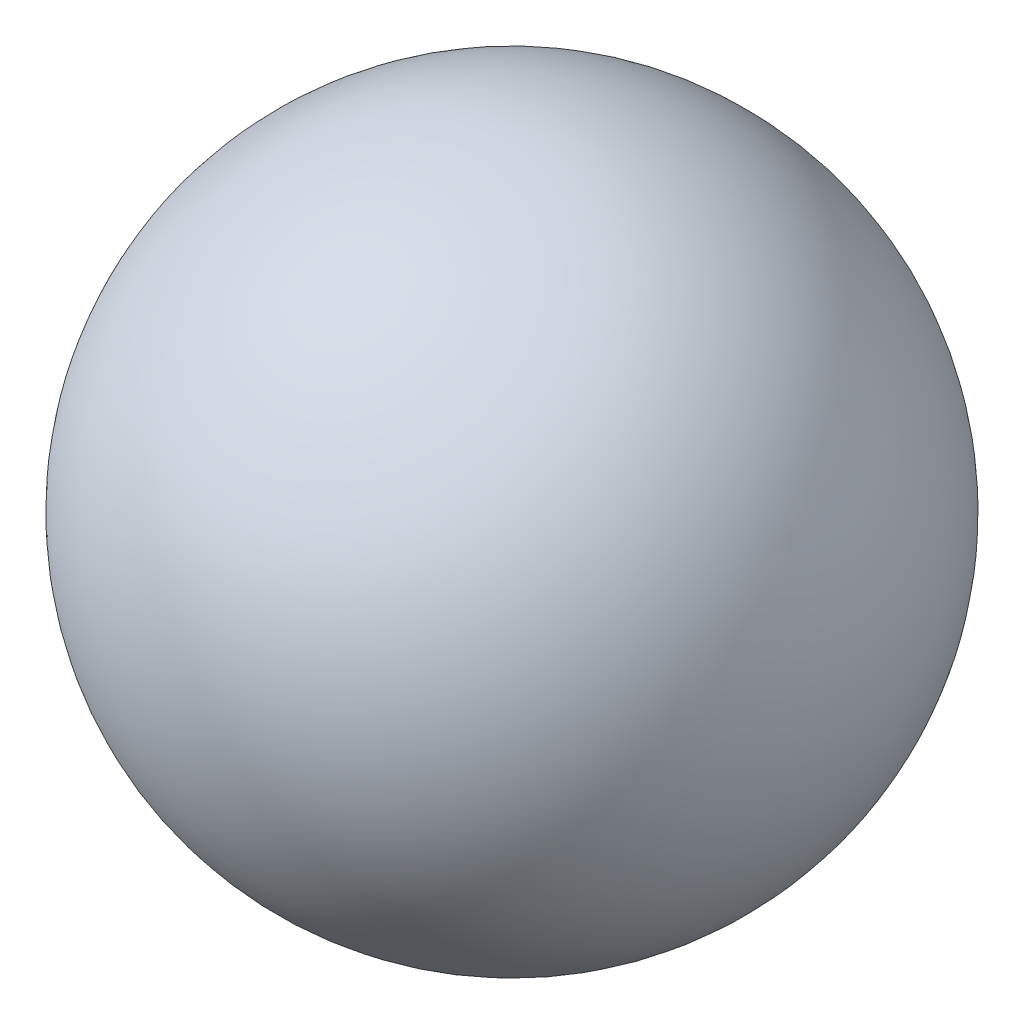
ISO-10303-21;
HEADER;
FILE_DESCRIPTION(('STEP AP214'),'2;1');
FILE_NAME('part.step','',(''),(''),'','','');
FILE_SCHEMA(('AUTOMOTIVE_DESIGN { 1 0 10303 214 1 1 1 1 }'));
ENDSEC;
DATA;
#1=APPLICATION_CONTEXT('core data for automotive mechanical design processes');
#2=APPLICATION_PROTOCOL_DEFINITION('international standard','automotive_design',2000,#1);
#3=PRODUCT_CONTEXT('',#1,'mechanical');
#4=PRODUCT('Part','Part','',(#3));
#5=PRODUCT_RELATED_PRODUCT_CATEGORY('part','',(#4));
#6=PRODUCT_DEFINITION_FORMATION('','',#4);
#7=PRODUCT_DEFINITION_CONTEXT('part definition',#1,'design');
#8=PRODUCT_DEFINITION('design','',#6,#7);
#9=PRODUCT_DEFINITION_SHAPE('','',#8);
#10=(LENGTH_UNIT() NAMED_UNIT(*) SI_UNIT(.MILLI.,.METRE.));
#11=(NAMED_UNIT(*) PLANE_ANGLE_UNIT() SI_UNIT($,.RADIAN.));
#12=(NAMED_UNIT(*) SI_UNIT($,.STERADIAN.) SOLID_ANGLE_UNIT());
#13=UNCERTAINTY_MEASURE_WITH_UNIT(LENGTH_MEASURE(1.E-05),#10,'distance_accuracy_value','');
#14=(GEOMETRIC_REPRESENTATION_CONTEXT(3) GLOBAL_UNCERTAINTY_ASSIGNED_CONTEXT((#13)) GLOBAL_UNIT_ASSIGNED_CONTEXT((#10,
#11,#12)) REPRESENTATION_CONTEXT('',''));
#15=CARTESIAN_POINT('',(0.,0.,0.));
#16=DIRECTION('',(0.,0.,1.));
#17=DIRECTION('',(1.,0.,0.));
#18=AXIS2_PLACEMENT_3D('',#15,#16,#17);
#19=CARTESIAN_POINT('',(0.,0.,0.));
#20=DIRECTION('',(-1.,0.,0.));
#21=DIRECTION('',(0.,1.,0.));
#22=AXIS2_PLACEMENT_3D('',#19,#20,#21);
#23=SPHERICAL_SURFACE('',#22,9.5);
#24=CARTESIAN_POINT('',(-9.5,0.,0.));
#25=VERTEX_POINT('',#24);
#26=VERTEX_LOOP('',#25);
#27=FACE_BOUND('',#26,.T.);
#28=ADVANCED_FACE('F29',(#27),#23,.T.);
#29=CLOSED_SHELL('',(#28));
#30=MANIFOLD_SOLID_BREP('B2',#29);
#31=ADVANCED_BREP_SHAPE_REPRESENTATION('',(#18,#30),#14);
#32=SHAPE_DEFINITION_REPRESENTATION(#9,#31);
ENDSEC;
END-ISO-10303-21;
